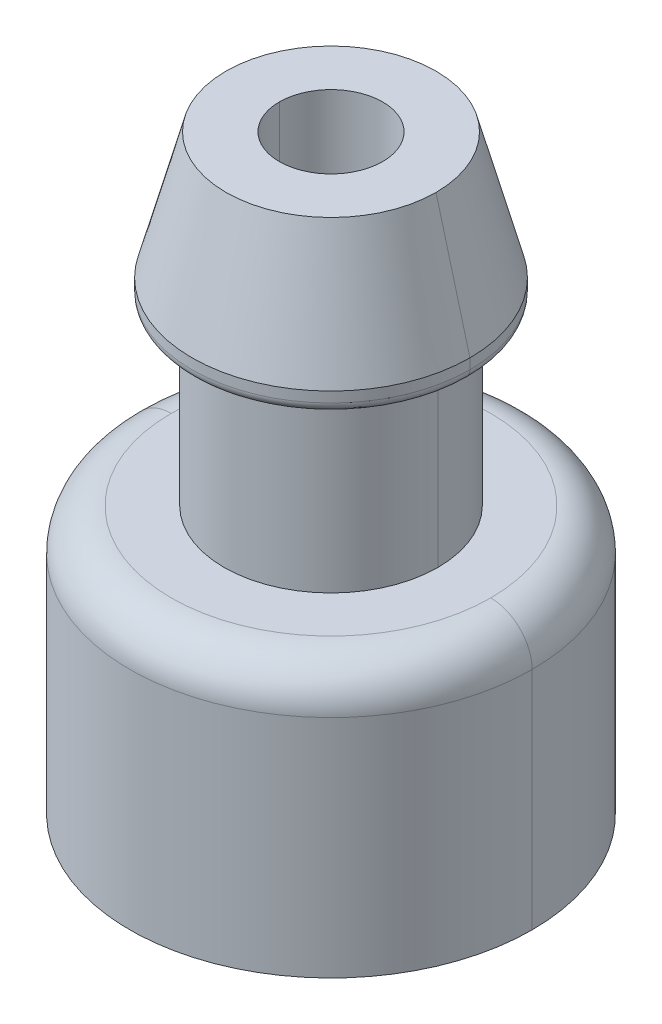
ISO-10303-21;
HEADER;
FILE_DESCRIPTION(('STEP AP214'),'2;1');
FILE_NAME('part.step','',(''),(''),'','','');
FILE_SCHEMA(('AUTOMOTIVE_DESIGN { 1 0 10303 214 1 1 1 1 }'));
ENDSEC;
DATA;
#1=APPLICATION_CONTEXT('core data for automotive mechanical design processes');
#2=APPLICATION_PROTOCOL_DEFINITION('international standard','automotive_design',2000,#1);
#3=PRODUCT_CONTEXT('',#1,'mechanical');
#4=PRODUCT('Part','Part','',(#3));
#5=PRODUCT_RELATED_PRODUCT_CATEGORY('part','',(#4));
#6=PRODUCT_DEFINITION_FORMATION('','',#4);
#7=PRODUCT_DEFINITION_CONTEXT('part definition',#1,'design');
#8=PRODUCT_DEFINITION('design','',#6,#7);
#9=PRODUCT_DEFINITION_SHAPE('','',#8);
#10=(LENGTH_UNIT() NAMED_UNIT(*) SI_UNIT(.MILLI.,.METRE.));
#11=(NAMED_UNIT(*) PLANE_ANGLE_UNIT() SI_UNIT($,.RADIAN.));
#12=(NAMED_UNIT(*) SI_UNIT($,.STERADIAN.) SOLID_ANGLE_UNIT());
#13=UNCERTAINTY_MEASURE_WITH_UNIT(LENGTH_MEASURE(1.E-05),#10,'distance_accuracy_value','');
#14=(GEOMETRIC_REPRESENTATION_CONTEXT(3) GLOBAL_UNCERTAINTY_ASSIGNED_CONTEXT((#13)) GLOBAL_UNIT_ASSIGNED_CONTEXT((#10,
#11,#12)) REPRESENTATION_CONTEXT('',''));
#15=CARTESIAN_POINT('',(0.,0.,0.));
#16=DIRECTION('',(0.,0.,1.));
#17=DIRECTION('',(1.,0.,0.));
#18=AXIS2_PLACEMENT_3D('',#15,#16,#17);
#19=CARTESIAN_POINT('',(0.,-0.833668176677836,0.));
#20=DIRECTION('',(0.,-1.,0.));
#21=DIRECTION('',(1.,0.,0.));
#22=AXIS2_PLACEMENT_3D('',#19,#20,#21);
#23=TOROIDAL_SURFACE('',#22,8.69,2.54);
#24=CARTESIAN_POINT('',(0.,-3.37366817667783,0.));
#25=DIRECTION('',(0.,1.,0.));
#26=DIRECTION('',(1.,0.,0.));
#27=AXIS2_PLACEMENT_3D('',#24,#25,#26);
#28=CIRCLE('',#27,8.69);
#29=CARTESIAN_POINT('',(-8.69,-3.37366817667783,0.));
#30=VERTEX_POINT('',#29);
#31=CARTESIAN_POINT('',(8.69,-3.37366817667784,0.));
#32=VERTEX_POINT('',#31);
#33=EDGE_CURVE('E50',#30,#32,#28,.T.);
#34=ORIENTED_EDGE('',*,*,#33,.F.);
#35=CARTESIAN_POINT('',(-8.69,-0.833668176677832,0.));
#36=DIRECTION('',(0.,0.,1.));
#37=DIRECTION('',(1.,0.,0.));
#38=AXIS2_PLACEMENT_3D('',#35,#36,#37);
#39=CIRCLE('',#38,2.54);
#40=CARTESIAN_POINT('',(-6.15,-0.833668176677834,0.));
#41=VERTEX_POINT('',#40);
#42=EDGE_CURVE('E13',#30,#41,#39,.T.);
#43=ORIENTED_EDGE('',*,*,#42,.T.);
#44=CARTESIAN_POINT('',(0.,-0.833668176677837,0.));
#45=DIRECTION('',(0.,-1.,0.));
#46=DIRECTION('',(1.,0.,0.));
#47=AXIS2_PLACEMENT_3D('',#44,#45,#46);
#48=CIRCLE('',#47,6.15);
#49=CARTESIAN_POINT('',(6.15,-0.83366817667784,0.));
#50=VERTEX_POINT('',#49);
#51=EDGE_CURVE('E275',#50,#41,#48,.T.);
#52=ORIENTED_EDGE('',*,*,#51,.F.);
#53=CARTESIAN_POINT('',(8.69,-0.833668176677841,0.));
#54=DIRECTION('',(0.,0.,-1.));
#55=DIRECTION('',(-1.,0.,0.));
#56=AXIS2_PLACEMENT_3D('',#53,#54,#55);
#57=CIRCLE('',#56,2.54);
#58=EDGE_CURVE('E188',#32,#50,#57,.T.);
#59=ORIENTED_EDGE('',*,*,#58,.F.);
#60=EDGE_LOOP('',(#34,#43,#52,#59));
#61=FACE_BOUND('',#60,.T.);
#62=ADVANCED_FACE('F25',(#61),#23,.T.);
#63=CARTESIAN_POINT('',(0.,7.03433182332216,0.));
#64=DIRECTION('',(0.,1.,0.));
#65=DIRECTION('',(-1.,0.,0.));
#66=AXIS2_PLACEMENT_3D('',#63,#64,#65);
#67=TOROIDAL_SURFACE('',#66,5.65,0.5);
#68=CARTESIAN_POINT('',(0.,7.03433182332216,0.));
#69=DIRECTION('',(0.,1.,0.));
#70=DIRECTION('',(-1.,0.,0.));
#71=AXIS2_PLACEMENT_3D('',#68,#69,#70);
#72=CIRCLE('',#71,6.15);
#73=CARTESIAN_POINT('',(6.15,7.03433182332216,0.));
#74=VERTEX_POINT('',#73);
#75=CARTESIAN_POINT('',(-6.15,7.03433182332216,0.));
#76=VERTEX_POINT('',#75);
#77=EDGE_CURVE('E257',#74,#76,#72,.T.);
#78=ORIENTED_EDGE('',*,*,#77,.F.);
#79=CARTESIAN_POINT('',(5.65,7.03433182332216,0.));
#80=DIRECTION('',(0.,0.,1.));
#81=DIRECTION('',(1.,0.,0.));
#82=AXIS2_PLACEMENT_3D('',#79,#80,#81);
#83=CIRCLE('',#82,0.5);
#84=CARTESIAN_POINT('',(5.65,7.53433182332216,0.));
#85=VERTEX_POINT('',#84);
#86=EDGE_CURVE('E36',#74,#85,#83,.T.);
#87=ORIENTED_EDGE('',*,*,#86,.T.);
#88=CARTESIAN_POINT('',(0.,7.53433182332216,0.));
#89=DIRECTION('',(0.,1.,0.));
#90=DIRECTION('',(-1.,0.,0.));
#91=AXIS2_PLACEMENT_3D('',#88,#89,#90);
#92=CIRCLE('',#91,5.65);
#93=CARTESIAN_POINT('',(-5.65,7.53433182332216,0.));
#94=VERTEX_POINT('',#93);
#95=EDGE_CURVE('E702',#85,#94,#92,.T.);
#96=ORIENTED_EDGE('',*,*,#95,.T.);
#97=CARTESIAN_POINT('',(-5.65,7.03433182332216,0.));
#98=DIRECTION('',(0.,0.,-1.));
#99=DIRECTION('',(-1.,0.,0.));
#100=AXIS2_PLACEMENT_3D('',#97,#98,#99);
#101=CIRCLE('',#100,0.5);
#102=EDGE_CURVE('E211',#76,#94,#101,.T.);
#103=ORIENTED_EDGE('',*,*,#102,.F.);
#104=EDGE_LOOP('',(#78,#87,#96,#103));
#105=FACE_BOUND('',#104,.T.);
#106=ADVANCED_FACE('F402',(#105),#67,.F.);
#107=CARTESIAN_POINT('',(0.,0.,0.));
#108=DIRECTION('',(0.,1.,0.));
#109=DIRECTION('',(-1.,0.,0.));
#110=AXIS2_PLACEMENT_3D('',#107,#108,#109);
#111=CYLINDRICAL_SURFACE('',#110,6.15);
#112=CARTESIAN_POINT('',(0.,-0.833668176677837,0.));
#113=DIRECTION('',(0.,-1.,0.));
#114=DIRECTION('',(1.,0.,0.));
#115=AXIS2_PLACEMENT_3D('',#112,#113,#114);
#116=CIRCLE('',#115,6.15);
#117=EDGE_CURVE('E256',#41,#50,#116,.T.);
#118=ORIENTED_EDGE('',*,*,#117,.T.);
#119=DIRECTION('',(0.,1.,0.));
#120=VECTOR('',#119,1.);
#121=CARTESIAN_POINT('',(6.15,0.,0.));
#122=LINE('',#121,#120);
#123=EDGE_CURVE('E252',#50,#74,#122,.T.);
#124=ORIENTED_EDGE('',*,*,#123,.T.);
#125=ORIENTED_EDGE('',*,*,#77,.T.);
#126=DIRECTION('',(0.,1.,0.));
#127=VECTOR('',#126,1.);
#128=CARTESIAN_POINT('',(-6.15,0.,0.));
#129=LINE('',#128,#127);
#130=EDGE_CURVE('E281',#41,#76,#129,.T.);
#131=ORIENTED_EDGE('',*,*,#130,.F.);
#132=EDGE_LOOP('',(#118,#124,#125,#131));
#133=FACE_BOUND('',#132,.T.);
#134=ADVANCED_FACE('F407',(#133),#111,.F.);
#135=CARTESIAN_POINT('',(0.,0.,0.));
#136=DIRECTION('',(0.,1.,0.));
#137=DIRECTION('',(-1.,0.,0.));
#138=AXIS2_PLACEMENT_3D('',#135,#136,#137);
#139=CYLINDRICAL_SURFACE('',#138,9.7282);
#140=CARTESIAN_POINT('',(0.,-3.37366817667783,0.));
#141=DIRECTION('',(0.,1.,0.));
#142=DIRECTION('',(-1.,0.,0.));
#143=AXIS2_PLACEMENT_3D('',#140,#141,#142);
#144=CIRCLE('',#143,9.7282);
#145=CARTESIAN_POINT('',(-9.7282,-3.37366817667783,0.));
#146=VERTEX_POINT('',#145);
#147=CARTESIAN_POINT('',(9.7282,-3.37366817667784,0.));
#148=VERTEX_POINT('',#147);
#149=EDGE_CURVE('E300',#146,#148,#144,.T.);
#150=ORIENTED_EDGE('',*,*,#149,.T.);
#151=DIRECTION('',(0.,1.,0.));
#152=VECTOR('',#151,1.);
#153=CARTESIAN_POINT('',(9.7282,0.,0.));
#154=LINE('',#153,#152);
#155=CARTESIAN_POINT('',(9.7282,7.53433182332216,0.));
#156=VERTEX_POINT('',#155);
#157=EDGE_CURVE('E305',#148,#156,#154,.T.);
#158=ORIENTED_EDGE('',*,*,#157,.T.);
#159=CARTESIAN_POINT('',(0.,7.53433182332216,0.));
#160=DIRECTION('',(0.,1.,0.));
#161=DIRECTION('',(-1.,0.,0.));
#162=AXIS2_PLACEMENT_3D('',#159,#160,#161);
#163=CIRCLE('',#162,9.7282);
#164=CARTESIAN_POINT('',(-9.7282,7.53433182332217,0.));
#165=VERTEX_POINT('',#164);
#166=EDGE_CURVE('E301',#165,#156,#163,.T.);
#167=ORIENTED_EDGE('',*,*,#166,.F.);
#168=DIRECTION('',(0.,1.,0.));
#169=VECTOR('',#168,1.);
#170=CARTESIAN_POINT('',(-9.7282,0.,0.));
#171=LINE('',#170,#169);
#172=EDGE_CURVE('E121',#146,#165,#171,.T.);
#173=ORIENTED_EDGE('',*,*,#172,.F.);
#174=EDGE_LOOP('',(#150,#158,#167,#173));
#175=FACE_BOUND('',#174,.T.);
#176=ADVANCED_FACE('F430',(#175),#139,.T.);
#177=CARTESIAN_POINT('',(0.,7.53433182332216,0.));
#178=DIRECTION('',(0.,1.,0.));
#179=DIRECTION('',(-1.,0.,0.));
#180=AXIS2_PLACEMENT_3D('',#177,#178,#179);
#181=TOROIDAL_SURFACE('',#180,7.7282,2.);
#182=ORIENTED_EDGE('',*,*,#166,.T.);
#183=CARTESIAN_POINT('',(7.7282,7.53433182332216,0.));
#184=DIRECTION('',(0.,0.,1.));
#185=DIRECTION('',(1.,0.,0.));
#186=AXIS2_PLACEMENT_3D('',#183,#184,#185);
#187=CIRCLE('',#186,2.);
#188=CARTESIAN_POINT('',(7.7282,9.53433182332216,0.));
#189=VERTEX_POINT('',#188);
#190=EDGE_CURVE('E306',#156,#189,#187,.T.);
#191=ORIENTED_EDGE('',*,*,#190,.T.);
#192=CARTESIAN_POINT('',(0.,9.53433182332216,0.));
#193=DIRECTION('',(0.,1.,0.));
#194=DIRECTION('',(-1.,0.,0.));
#195=AXIS2_PLACEMENT_3D('',#192,#193,#194);
#196=CIRCLE('',#195,7.7282);
#197=CARTESIAN_POINT('',(-7.7282,9.53433182332216,0.));
#198=VERTEX_POINT('',#197);
#199=EDGE_CURVE('E110',#198,#189,#196,.T.);
#200=ORIENTED_EDGE('',*,*,#199,.F.);
#201=CARTESIAN_POINT('',(-7.7282,7.53433182332216,0.));
#202=DIRECTION('',(0.,0.,-1.));
#203=DIRECTION('',(-1.,0.,0.));
#204=AXIS2_PLACEMENT_3D('',#201,#202,#203);
#205=CIRCLE('',#204,2.);
#206=EDGE_CURVE('E243',#165,#198,#205,.T.);
#207=ORIENTED_EDGE('',*,*,#206,.F.);
#208=EDGE_LOOP('',(#182,#191,#200,#207));
#209=FACE_BOUND('',#208,.T.);
#210=ADVANCED_FACE('F439',(#209),#181,.T.);
#211=CARTESIAN_POINT('',(0.,0.,0.));
#212=DIRECTION('',(0.,1.,0.));
#213=DIRECTION('',(-1.,0.,0.));
#214=AXIS2_PLACEMENT_3D('',#211,#212,#213);
#215=CYLINDRICAL_SURFACE('',#214,5.175);
#216=CARTESIAN_POINT('',(0.,9.53433182332216,0.));
#217=DIRECTION('',(0.,1.,0.));
#218=DIRECTION('',(-1.,0.,0.));
#219=AXIS2_PLACEMENT_3D('',#216,#217,#218);
#220=CIRCLE('',#219,5.175);
#221=CARTESIAN_POINT('',(-5.175,9.53433182332216,0.));
#222=VERTEX_POINT('',#221);
#223=CARTESIAN_POINT('',(5.175,9.53433182332216,0.));
#224=VERTEX_POINT('',#223);
#225=EDGE_CURVE('E284',#222,#224,#220,.T.);
#226=ORIENTED_EDGE('',*,*,#225,.T.);
#227=DIRECTION('',(0.,1.,0.));
#228=VECTOR('',#227,1.);
#229=CARTESIAN_POINT('',(5.175,0.,0.));
#230=LINE('',#229,#228);
#231=CARTESIAN_POINT('',(5.175,18.0833317633222,0.));
#232=VERTEX_POINT('',#231);
#233=EDGE_CURVE('E292',#224,#232,#230,.T.);
#234=ORIENTED_EDGE('',*,*,#233,.T.);
#235=CARTESIAN_POINT('',(0.,18.0833317633222,0.));
#236=DIRECTION('',(0.,1.,0.));
#237=DIRECTION('',(-1.,0.,0.));
#238=AXIS2_PLACEMENT_3D('',#235,#236,#237);
#239=CIRCLE('',#238,5.175);
#240=CARTESIAN_POINT('',(-5.175,18.0833317633222,0.));
#241=VERTEX_POINT('',#240);
#242=EDGE_CURVE('E340',#241,#232,#239,.T.);
#243=ORIENTED_EDGE('',*,*,#242,.F.);
#244=DIRECTION('',(0.,1.,0.));
#245=VECTOR('',#244,1.);
#246=CARTESIAN_POINT('',(-5.175,0.,0.));
#247=LINE('',#246,#245);
#248=EDGE_CURVE('E264',#222,#241,#247,.T.);
#249=ORIENTED_EDGE('',*,*,#248,.F.);
#250=EDGE_LOOP('',(#226,#234,#243,#249));
#251=FACE_BOUND('',#250,.T.);
#252=ADVANCED_FACE('F397',(#251),#215,.T.);
#253=CARTESIAN_POINT('',(0.,18.5833317633221,0.));
#254=DIRECTION('',(0.,1.,0.));
#255=DIRECTION('',(-1.,0.,0.));
#256=AXIS2_PLACEMENT_3D('',#253,#254,#255);
#257=TOROIDAL_SURFACE('',#256,6.21887128061717,0.5);
#258=CARTESIAN_POINT('',(0.,18.0833317633222,0.));
#259=DIRECTION('',(0.,1.,0.));
#260=DIRECTION('',(-1.,0.,0.));
#261=AXIS2_PLACEMENT_3D('',#258,#259,#260);
#262=CIRCLE('',#261,6.21887128061717);
#263=CARTESIAN_POINT('',(-6.21887128061716,18.0833317633222,0.));
#264=VERTEX_POINT('',#263);
#265=CARTESIAN_POINT('',(6.21887128061718,18.0833317633222,0.));
#266=VERTEX_POINT('',#265);
#267=EDGE_CURVE('E296',#264,#266,#262,.T.);
#268=ORIENTED_EDGE('',*,*,#267,.T.);
#269=CARTESIAN_POINT('',(6.21887128061718,18.5833317633221,0.));
#270=DIRECTION('',(0.,0.,1.));
#271=DIRECTION('',(1.,0.,0.));
#272=AXIS2_PLACEMENT_3D('',#269,#270,#271);
#273=CIRCLE('',#272,0.5);
#274=CARTESIAN_POINT('',(6.71887128061718,18.5833317633221,0.));
#275=VERTEX_POINT('',#274);
#276=EDGE_CURVE('E325',#266,#275,#273,.T.);
#277=ORIENTED_EDGE('',*,*,#276,.T.);
#278=CARTESIAN_POINT('',(0.,18.5833317633221,0.));
#279=DIRECTION('',(0.,1.,0.));
#280=DIRECTION('',(-1.,0.,0.));
#281=AXIS2_PLACEMENT_3D('',#278,#279,#280);
#282=CIRCLE('',#281,6.71887128061717);
#283=CARTESIAN_POINT('',(-6.71887128061716,18.5833317633221,0.));
#284=VERTEX_POINT('',#283);
#285=EDGE_CURVE('E215',#284,#275,#282,.T.);
#286=ORIENTED_EDGE('',*,*,#285,.F.);
#287=CARTESIAN_POINT('',(-6.21887128061716,18.5833317633221,0.));
#288=DIRECTION('',(0.,0.,-1.));
#289=DIRECTION('',(-1.,0.,0.));
#290=AXIS2_PLACEMENT_3D('',#287,#288,#289);
#291=CIRCLE('',#290,0.5);
#292=EDGE_CURVE('E29',#264,#284,#291,.T.);
#293=ORIENTED_EDGE('',*,*,#292,.F.);
#294=EDGE_LOOP('',(#268,#277,#286,#293));
#295=FACE_BOUND('',#294,.T.);
#296=ADVANCED_FACE('F379',(#295),#257,.T.);
#297=CARTESIAN_POINT('',(0.,0.,0.));
#298=DIRECTION('',(0.,1.,0.));
#299=DIRECTION('',(-1.,0.,0.));
#300=AXIS2_PLACEMENT_3D('',#297,#298,#299);
#301=CYLINDRICAL_SURFACE('',#300,6.71887128061717);
#302=ORIENTED_EDGE('',*,*,#285,.T.);
#303=DIRECTION('',(0.,1.,0.));
#304=VECTOR('',#303,1.);
#305=CARTESIAN_POINT('',(6.71887128061717,0.,0.));
#306=LINE('',#305,#304);
#307=CARTESIAN_POINT('',(6.71887128061718,19.0833317633221,0.));
#308=VERTEX_POINT('',#307);
#309=EDGE_CURVE('E309',#275,#308,#306,.T.);
#310=ORIENTED_EDGE('',*,*,#309,.T.);
#311=CARTESIAN_POINT('',(0.,19.0833317633221,0.));
#312=DIRECTION('',(0.,1.,0.));
#313=DIRECTION('',(-1.,0.,0.));
#314=AXIS2_PLACEMENT_3D('',#311,#312,#313);
#315=CIRCLE('',#314,6.71887128061717);
#316=CARTESIAN_POINT('',(-6.71887128061716,19.0833317633221,0.));
#317=VERTEX_POINT('',#316);
#318=EDGE_CURVE('E217',#317,#308,#315,.T.);
#319=ORIENTED_EDGE('',*,*,#318,.F.);
#320=DIRECTION('',(0.,1.,0.));
#321=VECTOR('',#320,1.);
#322=CARTESIAN_POINT('',(-6.71887128061717,0.,0.));
#323=LINE('',#322,#321);
#324=EDGE_CURVE('E221',#284,#317,#323,.T.);
#325=ORIENTED_EDGE('',*,*,#324,.F.);
#326=EDGE_LOOP('',(#302,#310,#319,#325));
#327=FACE_BOUND('',#326,.T.);
#328=ADVANCED_FACE('F388',(#327),#301,.T.);
#329=CARTESIAN_POINT('',(0.,25.1953317633222,0.));
#330=DIRECTION('',(0.,-1.,0.));
#331=DIRECTION('',(1.,0.,0.));
#332=AXIS2_PLACEMENT_3D('',#329,#330,#331);
#333=CONICAL_SURFACE('',#332,5.08,0.261977344229873);
#334=CARTESIAN_POINT('',(0.,25.1953317633222,0.));
#335=DIRECTION('',(0.,1.,0.));
#336=DIRECTION('',(-1.,0.,0.));
#337=AXIS2_PLACEMENT_3D('',#334,#335,#336);
#338=CIRCLE('',#337,5.08);
#339=CARTESIAN_POINT('',(-5.08,25.1953317633222,0.));
#340=VERTEX_POINT('',#339);
#341=CARTESIAN_POINT('',(5.08,25.1953317633222,0.));
#342=VERTEX_POINT('',#341);
#343=EDGE_CURVE('E345',#340,#342,#338,.T.);
#344=ORIENTED_EDGE('',*,*,#343,.F.);
#345=DIRECTION('',(-0.2589909337158,-0.965879752481135,0.));
#346=VECTOR('',#345,1.);
#347=CARTESIAN_POINT('',(-5.08,25.1953317633222,0.));
#348=LINE('',#347,#346);
#349=EDGE_CURVE('E220',#340,#317,#348,.T.);
#350=ORIENTED_EDGE('',*,*,#349,.T.);
#351=ORIENTED_EDGE('',*,*,#318,.T.);
#352=DIRECTION('',(0.258990933715799,-0.965879752481135,0.));
#353=VECTOR('',#352,1.);
#354=CARTESIAN_POINT('',(5.08,25.1953317633222,0.));
#355=LINE('',#354,#353);
#356=EDGE_CURVE('E262',#342,#308,#355,.T.);
#357=ORIENTED_EDGE('',*,*,#356,.F.);
#358=EDGE_LOOP('',(#344,#350,#351,#357));
#359=FACE_BOUND('',#358,.T.);
#360=ADVANCED_FACE('F387',(#359),#333,.T.);
#361=CARTESIAN_POINT('',(0.,0.,0.));
#362=DIRECTION('',(0.,1.,0.));
#363=DIRECTION('',(-1.,0.,0.));
#364=AXIS2_PLACEMENT_3D('',#361,#362,#363);
#365=CYLINDRICAL_SURFACE('',#364,2.5);
#366=CARTESIAN_POINT('',(0.,7.53433182332216,0.));
#367=DIRECTION('',(0.,1.,0.));
#368=DIRECTION('',(-1.,0.,0.));
#369=AXIS2_PLACEMENT_3D('',#366,#367,#368);
#370=CIRCLE('',#369,2.5);
#371=CARTESIAN_POINT('',(2.5,7.53433182332216,0.));
#372=VERTEX_POINT('',#371);
#373=CARTESIAN_POINT('',(-2.5,7.53433182332216,0.));
#374=VERTEX_POINT('',#373);
#375=EDGE_CURVE('E179',#372,#374,#370,.T.);
#376=ORIENTED_EDGE('',*,*,#375,.F.);
#377=DIRECTION('',(0.,1.,0.));
#378=VECTOR('',#377,1.);
#379=CARTESIAN_POINT('',(2.5,0.,0.));
#380=LINE('',#379,#378);
#381=CARTESIAN_POINT('',(2.5,25.1953317633222,0.));
#382=VERTEX_POINT('',#381);
#383=EDGE_CURVE('E201',#372,#382,#380,.T.);
#384=ORIENTED_EDGE('',*,*,#383,.T.);
#385=CARTESIAN_POINT('',(0.,25.1953317633222,0.));
#386=DIRECTION('',(0.,1.,0.));
#387=DIRECTION('',(-1.,0.,0.));
#388=AXIS2_PLACEMENT_3D('',#385,#386,#387);
#389=CIRCLE('',#388,2.5);
#390=CARTESIAN_POINT('',(-2.49999999999997,25.1953317633222,0.));
#391=VERTEX_POINT('',#390);
#392=EDGE_CURVE('E193',#382,#391,#389,.T.);
#393=ORIENTED_EDGE('',*,*,#392,.T.);
#394=DIRECTION('',(0.,1.,0.));
#395=VECTOR('',#394,1.);
#396=CARTESIAN_POINT('',(-2.5,0.,0.));
#397=LINE('',#396,#395);
#398=EDGE_CURVE('E191',#374,#391,#397,.T.);
#399=ORIENTED_EDGE('',*,*,#398,.F.);
#400=EDGE_LOOP('',(#376,#384,#393,#399));
#401=FACE_BOUND('',#400,.T.);
#402=ADVANCED_FACE('F192',(#401),#365,.F.);
#403=CARTESIAN_POINT('',(0.,0.,0.));
#404=DIRECTION('',(0.,1.,0.));
#405=DIRECTION('',(-1.,0.,0.));
#406=AXIS2_PLACEMENT_3D('',#403,#404,#405);
#407=CYLINDRICAL_SURFACE('',#406,2.5);
#408=ORIENTED_EDGE('',*,*,#383,.F.);
#409=CARTESIAN_POINT('',(0.,7.53433182332216,0.));
#410=DIRECTION('',(0.,1.,0.));
#411=DIRECTION('',(-1.,0.,0.));
#412=AXIS2_PLACEMENT_3D('',#409,#410,#411);
#413=CIRCLE('',#412,2.5);
#414=EDGE_CURVE('E183',#374,#372,#413,.T.);
#415=ORIENTED_EDGE('',*,*,#414,.F.);
#416=ORIENTED_EDGE('',*,*,#398,.T.);
#417=CARTESIAN_POINT('',(0.,25.1953317633222,0.));
#418=DIRECTION('',(0.,1.,0.));
#419=DIRECTION('',(-1.,0.,0.));
#420=AXIS2_PLACEMENT_3D('',#417,#418,#419);
#421=CIRCLE('',#420,2.5);
#422=EDGE_CURVE('E198',#391,#382,#421,.T.);
#423=ORIENTED_EDGE('',*,*,#422,.T.);
#424=EDGE_LOOP('',(#408,#415,#416,#423));
#425=FACE_BOUND('',#424,.T.);
#426=ADVANCED_FACE('F200',(#425),#407,.F.);
#427=CARTESIAN_POINT('',(2.5,25.1953317633222,0.));
#428=DIRECTION('',(0.,1.,0.));
#429=DIRECTION('',(1.,0.,0.));
#430=AXIS2_PLACEMENT_3D('',#427,#428,#429);
#431=PLANE('',#430);
#432=CARTESIAN_POINT('',(0.,25.1953317633222,0.));
#433=DIRECTION('',(0.,1.,0.));
#434=DIRECTION('',(-1.,0.,0.));
#435=AXIS2_PLACEMENT_3D('',#432,#433,#434);
#436=CIRCLE('',#435,5.08);
#437=EDGE_CURVE('E332',#342,#340,#436,.T.);
#438=ORIENTED_EDGE('',*,*,#437,.T.);
#439=ORIENTED_EDGE('',*,*,#343,.T.);
#440=EDGE_LOOP('',(#438,#439));
#441=FACE_BOUND('',#440,.T.);
#442=ORIENTED_EDGE('',*,*,#422,.F.);
#443=ORIENTED_EDGE('',*,*,#392,.F.);
#444=EDGE_LOOP('',(#442,#443));
#445=FACE_BOUND('',#444,.T.);
#446=ADVANCED_FACE('F420',(#441,#445),#431,.T.);
#447=CARTESIAN_POINT('',(0.,25.1953317633222,0.));
#448=DIRECTION('',(0.,-1.,0.));
#449=DIRECTION('',(1.,0.,0.));
#450=AXIS2_PLACEMENT_3D('',#447,#448,#449);
#451=CONICAL_SURFACE('',#450,5.08,0.261977344229873);
#452=ORIENTED_EDGE('',*,*,#349,.F.);
#453=ORIENTED_EDGE('',*,*,#437,.F.);
#454=ORIENTED_EDGE('',*,*,#356,.T.);
#455=CARTESIAN_POINT('',(0.,19.0833317633221,0.));
#456=DIRECTION('',(0.,1.,0.));
#457=DIRECTION('',(-1.,0.,0.));
#458=AXIS2_PLACEMENT_3D('',#455,#456,#457);
#459=CIRCLE('',#458,6.71887128061717);
#460=EDGE_CURVE('E258',#308,#317,#459,.T.);
#461=ORIENTED_EDGE('',*,*,#460,.T.);
#462=EDGE_LOOP('',(#452,#453,#454,#461));
#463=FACE_BOUND('',#462,.T.);
#464=ADVANCED_FACE('F384',(#463),#451,.T.);
#465=CARTESIAN_POINT('',(0.,0.,0.));
#466=DIRECTION('',(0.,1.,0.));
#467=DIRECTION('',(-1.,0.,0.));
#468=AXIS2_PLACEMENT_3D('',#465,#466,#467);
#469=CYLINDRICAL_SURFACE('',#468,6.71887128061717);
#470=ORIENTED_EDGE('',*,*,#309,.F.);
#471=CARTESIAN_POINT('',(0.,18.5833317633221,0.));
#472=DIRECTION('',(0.,1.,0.));
#473=DIRECTION('',(-1.,0.,0.));
#474=AXIS2_PLACEMENT_3D('',#471,#472,#473);
#475=CIRCLE('',#474,6.71887128061717);
#476=EDGE_CURVE('E223',#275,#284,#475,.T.);
#477=ORIENTED_EDGE('',*,*,#476,.T.);
#478=ORIENTED_EDGE('',*,*,#324,.T.);
#479=ORIENTED_EDGE('',*,*,#460,.F.);
#480=EDGE_LOOP('',(#470,#477,#478,#479));
#481=FACE_BOUND('',#480,.T.);
#482=ADVANCED_FACE('F382',(#481),#469,.T.);
#483=CARTESIAN_POINT('',(0.,18.5833317633221,0.));
#484=DIRECTION('',(0.,1.,0.));
#485=DIRECTION('',(-1.,0.,0.));
#486=AXIS2_PLACEMENT_3D('',#483,#484,#485);
#487=TOROIDAL_SURFACE('',#486,6.21887128061717,0.5);
#488=ORIENTED_EDGE('',*,*,#276,.F.);
#489=CARTESIAN_POINT('',(0.,18.0833317633222,0.));
#490=DIRECTION('',(0.,1.,0.));
#491=DIRECTION('',(-1.,0.,0.));
#492=AXIS2_PLACEMENT_3D('',#489,#490,#491);
#493=CIRCLE('',#492,6.21887128061717);
#494=EDGE_CURVE('E224',#266,#264,#493,.T.);
#495=ORIENTED_EDGE('',*,*,#494,.T.);
#496=ORIENTED_EDGE('',*,*,#292,.T.);
#497=ORIENTED_EDGE('',*,*,#476,.F.);
#498=EDGE_LOOP('',(#488,#495,#496,#497));
#499=FACE_BOUND('',#498,.T.);
#500=ADVANCED_FACE('F373',(#499),#487,.T.);
#501=CARTESIAN_POINT('',(6.21887128061718,18.0833317633222,0.));
#502=DIRECTION('',(0.,-1.,0.));
#503=DIRECTION('',(-1.,0.,0.));
#504=AXIS2_PLACEMENT_3D('',#501,#502,#503);
#505=PLANE('',#504);
#506=ORIENTED_EDGE('',*,*,#267,.F.);
#507=ORIENTED_EDGE('',*,*,#494,.F.);
#508=EDGE_LOOP('',(#506,#507));
#509=FACE_BOUND('',#508,.T.);
#510=ORIENTED_EDGE('',*,*,#242,.T.);
#511=CARTESIAN_POINT('',(0.,18.0833317633222,0.));
#512=DIRECTION('',(0.,1.,0.));
#513=DIRECTION('',(-1.,0.,0.));
#514=AXIS2_PLACEMENT_3D('',#511,#512,#513);
#515=CIRCLE('',#514,5.175);
#516=EDGE_CURVE('E336',#232,#241,#515,.T.);
#517=ORIENTED_EDGE('',*,*,#516,.T.);
#518=EDGE_LOOP('',(#510,#517));
#519=FACE_BOUND('',#518,.T.);
#520=ADVANCED_FACE('F377',(#509,#519),#505,.T.);
#521=CARTESIAN_POINT('',(0.,0.,0.));
#522=DIRECTION('',(0.,1.,0.));
#523=DIRECTION('',(-1.,0.,0.));
#524=AXIS2_PLACEMENT_3D('',#521,#522,#523);
#525=CYLINDRICAL_SURFACE('',#524,5.175);
#526=ORIENTED_EDGE('',*,*,#233,.F.);
#527=CARTESIAN_POINT('',(0.,9.53433182332216,0.));
#528=DIRECTION('',(0.,1.,0.));
#529=DIRECTION('',(-1.,0.,0.));
#530=AXIS2_PLACEMENT_3D('',#527,#528,#529);
#531=CIRCLE('',#530,5.175);
#532=EDGE_CURVE('E341',#224,#222,#531,.T.);
#533=ORIENTED_EDGE('',*,*,#532,.T.);
#534=ORIENTED_EDGE('',*,*,#248,.T.);
#535=ORIENTED_EDGE('',*,*,#516,.F.);
#536=EDGE_LOOP('',(#526,#533,#534,#535));
#537=FACE_BOUND('',#536,.T.);
#538=ADVANCED_FACE('F442',(#537),#525,.T.);
#539=CARTESIAN_POINT('',(5.175,9.53433182332216,0.));
#540=DIRECTION('',(0.,1.,0.));
#541=DIRECTION('',(1.,0.,0.));
#542=AXIS2_PLACEMENT_3D('',#539,#540,#541);
#543=PLANE('',#542);
#544=ORIENTED_EDGE('',*,*,#199,.T.);
#545=CARTESIAN_POINT('',(0.,9.53433182332216,0.));
#546=DIRECTION('',(0.,1.,0.));
#547=DIRECTION('',(-1.,0.,0.));
#548=AXIS2_PLACEMENT_3D('',#545,#546,#547);
#549=CIRCLE('',#548,7.7282);
#550=EDGE_CURVE('E237',#189,#198,#549,.T.);
#551=ORIENTED_EDGE('',*,*,#550,.T.);
#552=EDGE_LOOP('',(#544,#551));
#553=FACE_BOUND('',#552,.T.);
#554=ORIENTED_EDGE('',*,*,#225,.F.);
#555=ORIENTED_EDGE('',*,*,#532,.F.);
#556=EDGE_LOOP('',(#554,#555));
#557=FACE_BOUND('',#556,.T.);
#558=ADVANCED_FACE('F460',(#553,#557),#543,.T.);
#559=CARTESIAN_POINT('',(0.,7.53433182332216,0.));
#560=DIRECTION('',(0.,1.,0.));
#561=DIRECTION('',(-1.,0.,0.));
#562=AXIS2_PLACEMENT_3D('',#559,#560,#561);
#563=TOROIDAL_SURFACE('',#562,7.7282,2.);
#564=ORIENTED_EDGE('',*,*,#190,.F.);
#565=CARTESIAN_POINT('',(0.,7.53433182332216,0.));
#566=DIRECTION('',(0.,1.,0.));
#567=DIRECTION('',(-1.,0.,0.));
#568=AXIS2_PLACEMENT_3D('',#565,#566,#567);
#569=CIRCLE('',#568,9.7282);
#570=EDGE_CURVE('E239',#156,#165,#569,.T.);
#571=ORIENTED_EDGE('',*,*,#570,.T.);
#572=ORIENTED_EDGE('',*,*,#206,.T.);
#573=ORIENTED_EDGE('',*,*,#550,.F.);
#574=EDGE_LOOP('',(#564,#571,#572,#573));
#575=FACE_BOUND('',#574,.T.);
#576=ADVANCED_FACE('F426',(#575),#563,.T.);
#577=CARTESIAN_POINT('',(0.,0.,0.));
#578=DIRECTION('',(0.,1.,0.));
#579=DIRECTION('',(-1.,0.,0.));
#580=AXIS2_PLACEMENT_3D('',#577,#578,#579);
#581=CYLINDRICAL_SURFACE('',#580,9.7282);
#582=ORIENTED_EDGE('',*,*,#157,.F.);
#583=CARTESIAN_POINT('',(0.,-3.37366817667783,0.));
#584=DIRECTION('',(0.,1.,0.));
#585=DIRECTION('',(-1.,0.,0.));
#586=AXIS2_PLACEMENT_3D('',#583,#584,#585);
#587=CIRCLE('',#586,9.7282);
#588=EDGE_CURVE('E248',#148,#146,#587,.T.);
#589=ORIENTED_EDGE('',*,*,#588,.T.);
#590=ORIENTED_EDGE('',*,*,#172,.T.);
#591=ORIENTED_EDGE('',*,*,#570,.F.);
#592=EDGE_LOOP('',(#582,#589,#590,#591));
#593=FACE_BOUND('',#592,.T.);
#594=ADVANCED_FACE('F415',(#593),#581,.T.);
#595=CARTESIAN_POINT('',(9.7282,-3.37366817667784,0.));
#596=DIRECTION('',(0.,-1.,0.));
#597=DIRECTION('',(-1.,0.,0.));
#598=AXIS2_PLACEMENT_3D('',#595,#596,#597);
#599=PLANE('',#598);
#600=ORIENTED_EDGE('',*,*,#149,.F.);
#601=ORIENTED_EDGE('',*,*,#588,.F.);
#602=EDGE_LOOP('',(#600,#601));
#603=FACE_BOUND('',#602,.T.);
#604=CARTESIAN_POINT('',(0.,-3.37366817667783,0.));
#605=DIRECTION('',(0.,1.,0.));
#606=DIRECTION('',(1.,0.,0.));
#607=AXIS2_PLACEMENT_3D('',#604,#605,#606);
#608=CIRCLE('',#607,8.69);
#609=EDGE_CURVE('E267',#32,#30,#608,.T.);
#610=ORIENTED_EDGE('',*,*,#609,.T.);
#611=ORIENTED_EDGE('',*,*,#33,.T.);
#612=EDGE_LOOP('',(#610,#611));
#613=FACE_BOUND('',#612,.T.);
#614=ADVANCED_FACE('F412',(#603,#613),#599,.T.);
#615=CARTESIAN_POINT('',(0.,0.,0.));
#616=DIRECTION('',(0.,1.,0.));
#617=DIRECTION('',(-1.,0.,0.));
#618=AXIS2_PLACEMENT_3D('',#615,#616,#617);
#619=CYLINDRICAL_SURFACE('',#618,6.15);
#620=ORIENTED_EDGE('',*,*,#123,.F.);
#621=ORIENTED_EDGE('',*,*,#51,.T.);
#622=ORIENTED_EDGE('',*,*,#130,.T.);
#623=CARTESIAN_POINT('',(0.,7.03433182332216,0.));
#624=DIRECTION('',(0.,1.,0.));
#625=DIRECTION('',(-1.,0.,0.));
#626=AXIS2_PLACEMENT_3D('',#623,#624,#625);
#627=CIRCLE('',#626,6.15);
#628=EDGE_CURVE('E247',#76,#74,#627,.T.);
#629=ORIENTED_EDGE('',*,*,#628,.T.);
#630=EDGE_LOOP('',(#620,#621,#622,#629));
#631=FACE_BOUND('',#630,.T.);
#632=ADVANCED_FACE('F414',(#631),#619,.F.);
#633=CARTESIAN_POINT('',(0.,7.03433182332216,0.));
#634=DIRECTION('',(0.,1.,0.));
#635=DIRECTION('',(-1.,0.,0.));
#636=AXIS2_PLACEMENT_3D('',#633,#634,#635);
#637=TOROIDAL_SURFACE('',#636,5.65,0.5);
#638=ORIENTED_EDGE('',*,*,#86,.F.);
#639=ORIENTED_EDGE('',*,*,#628,.F.);
#640=ORIENTED_EDGE('',*,*,#102,.T.);
#641=CARTESIAN_POINT('',(0.,7.53433182332216,0.));
#642=DIRECTION('',(0.,1.,0.));
#643=DIRECTION('',(-1.,0.,0.));
#644=AXIS2_PLACEMENT_3D('',#641,#642,#643);
#645=CIRCLE('',#644,5.65);
#646=EDGE_CURVE('E203',#94,#85,#645,.T.);
#647=ORIENTED_EDGE('',*,*,#646,.T.);
#648=EDGE_LOOP('',(#638,#639,#640,#647));
#649=FACE_BOUND('',#648,.T.);
#650=ADVANCED_FACE('F27',(#649),#637,.F.);
#651=CARTESIAN_POINT('',(5.65,7.53433182332216,0.));
#652=DIRECTION('',(0.,-1.,0.));
#653=DIRECTION('',(-1.,0.,0.));
#654=AXIS2_PLACEMENT_3D('',#651,#652,#653);
#655=PLANE('',#654);
#656=ORIENTED_EDGE('',*,*,#646,.F.);
#657=ORIENTED_EDGE('',*,*,#95,.F.);
#658=EDGE_LOOP('',(#656,#657));
#659=FACE_BOUND('',#658,.T.);
#660=ORIENTED_EDGE('',*,*,#414,.T.);
#661=ORIENTED_EDGE('',*,*,#375,.T.);
#662=EDGE_LOOP('',(#660,#661));
#663=FACE_BOUND('',#662,.T.);
#664=ADVANCED_FACE('F181',(#659,#663),#655,.T.);
#665=CARTESIAN_POINT('',(0.,-0.833668176677836,0.));
#666=DIRECTION('',(0.,-1.,0.));
#667=DIRECTION('',(1.,0.,0.));
#668=AXIS2_PLACEMENT_3D('',#665,#666,#667);
#669=TOROIDAL_SURFACE('',#668,8.69,2.54);
#670=ORIENTED_EDGE('',*,*,#42,.F.);
#671=ORIENTED_EDGE('',*,*,#609,.F.);
#672=ORIENTED_EDGE('',*,*,#58,.T.);
#673=ORIENTED_EDGE('',*,*,#117,.F.);
#674=EDGE_LOOP('',(#670,#671,#672,#673));
#675=FACE_BOUND('',#674,.T.);
#676=ADVANCED_FACE('F443',(#675),#669,.T.);
#677=CLOSED_SHELL('',(#62,#106,#134,#176,#210,#252,#296,#328,#360,#402,#426,#446,#464,#482,#500,
#520,#538,#558,#576,#594,#614,#632,#650,#664,#676));
#678=MANIFOLD_SOLID_BREP('B1',#677);
#679=ADVANCED_BREP_SHAPE_REPRESENTATION('',(#18,#678),#14);
#680=SHAPE_DEFINITION_REPRESENTATION(#9,#679);
ENDSEC;
END-ISO-10303-21;
